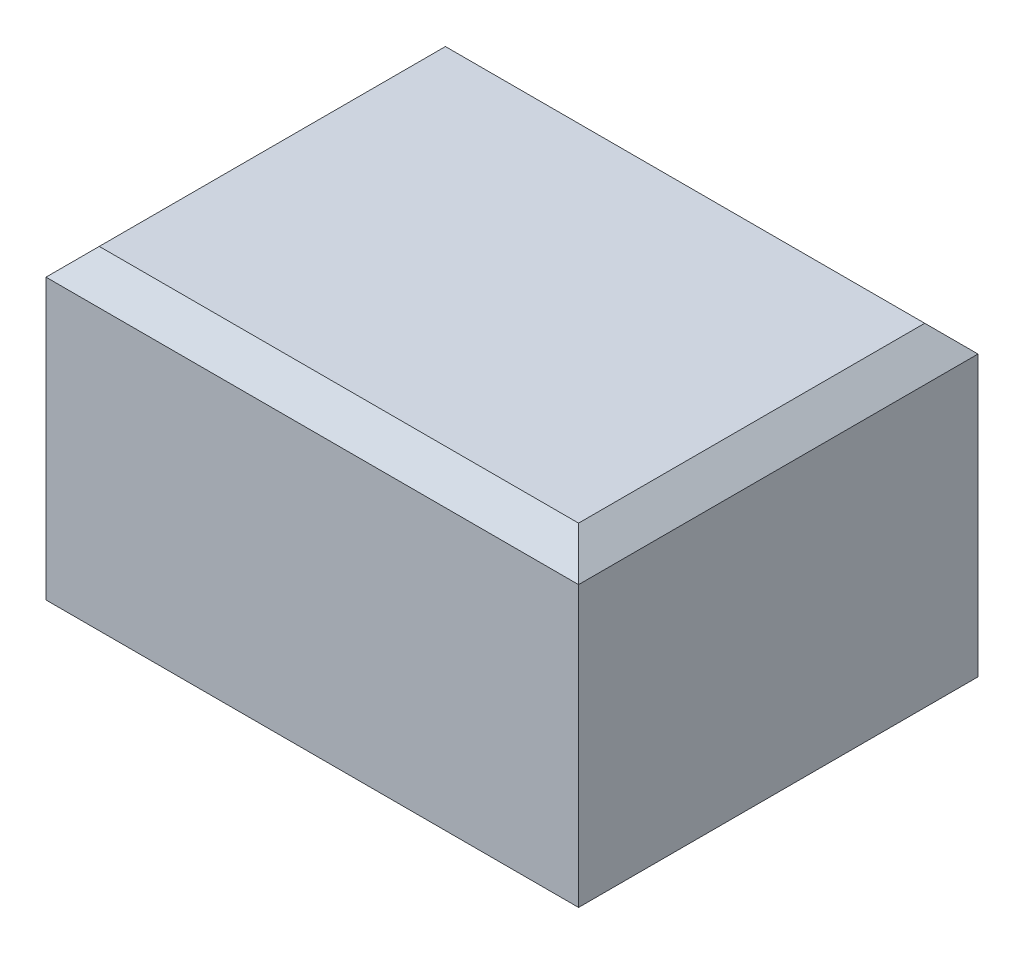
ISO-10303-21;
HEADER;
FILE_DESCRIPTION(('STEP AP214'),'2;1');
FILE_NAME('part.step','',(''),(''),'','','');
FILE_SCHEMA(('AUTOMOTIVE_DESIGN { 1 0 10303 214 1 1 1 1 }'));
ENDSEC;
DATA;
#1=APPLICATION_CONTEXT('core data for automotive mechanical design processes');
#2=APPLICATION_PROTOCOL_DEFINITION('international standard','automotive_design',2000,#1);
#3=PRODUCT_CONTEXT('',#1,'mechanical');
#4=PRODUCT('Part','Part','',(#3));
#5=PRODUCT_RELATED_PRODUCT_CATEGORY('part','',(#4));
#6=PRODUCT_DEFINITION_FORMATION('','',#4);
#7=PRODUCT_DEFINITION_CONTEXT('part definition',#1,'design');
#8=PRODUCT_DEFINITION('design','',#6,#7);
#9=PRODUCT_DEFINITION_SHAPE('','',#8);
#10=(LENGTH_UNIT() NAMED_UNIT(*) SI_UNIT(.MILLI.,.METRE.));
#11=(NAMED_UNIT(*) PLANE_ANGLE_UNIT() SI_UNIT($,.RADIAN.));
#12=(NAMED_UNIT(*) SI_UNIT($,.STERADIAN.) SOLID_ANGLE_UNIT());
#13=UNCERTAINTY_MEASURE_WITH_UNIT(LENGTH_MEASURE(1.E-05),#10,'distance_accuracy_value','');
#14=(GEOMETRIC_REPRESENTATION_CONTEXT(3) GLOBAL_UNCERTAINTY_ASSIGNED_CONTEXT((#13)) GLOBAL_UNIT_ASSIGNED_CONTEXT((#10,
#11,#12)) REPRESENTATION_CONTEXT('',''));
#15=CARTESIAN_POINT('',(0.,0.,0.));
#16=DIRECTION('',(0.,0.,1.));
#17=DIRECTION('',(1.,0.,0.));
#18=AXIS2_PLACEMENT_3D('',#15,#16,#17);
#19=CARTESIAN_POINT('',(200.,250.,-150.));
#20=DIRECTION('',(-1.,0.,0.));
#21=DIRECTION('',(0.,0.,1.));
#22=AXIS2_PLACEMENT_3D('',#19,#20,#21);
#23=PLANE('',#22);
#24=DIRECTION('',(0.,-1.,0.));
#25=VECTOR('',#24,1.);
#26=CARTESIAN_POINT('',(200.,250.,150.));
#27=LINE('',#26,#25);
#28=CARTESIAN_POINT('',(200.,230.,150.));
#29=VERTEX_POINT('',#28);
#30=CARTESIAN_POINT('',(200.,20.,150.));
#31=VERTEX_POINT('',#30);
#32=EDGE_CURVE('E167',#29,#31,#27,.T.);
#33=ORIENTED_EDGE('',*,*,#32,.T.);
#34=DIRECTION('',(0.,0.,-1.));
#35=VECTOR('',#34,1.);
#36=CARTESIAN_POINT('',(200.,20.,-150.));
#37=LINE('',#36,#35);
#38=CARTESIAN_POINT('',(200.,20.,-150.));
#39=VERTEX_POINT('',#38);
#40=EDGE_CURVE('E181',#31,#39,#37,.T.);
#41=ORIENTED_EDGE('',*,*,#40,.T.);
#42=DIRECTION('',(0.,-1.,0.));
#43=VECTOR('',#42,1.);
#44=CARTESIAN_POINT('',(200.,250.,-150.));
#45=LINE('',#44,#43);
#46=CARTESIAN_POINT('',(200.,230.,-150.));
#47=VERTEX_POINT('',#46);
#48=EDGE_CURVE('E138',#47,#39,#45,.T.);
#49=ORIENTED_EDGE('',*,*,#48,.F.);
#50=DIRECTION('',(0.,0.,1.));
#51=VECTOR('',#50,1.);
#52=CARTESIAN_POINT('',(200.,230.,150.));
#53=LINE('',#52,#51);
#54=EDGE_CURVE('E184',#47,#29,#53,.T.);
#55=ORIENTED_EDGE('',*,*,#54,.T.);
#56=EDGE_LOOP('',(#33,#41,#49,#55));
#57=FACE_BOUND('',#56,.T.);
#58=ADVANCED_FACE('F47',(#57),#23,.F.);
#59=CARTESIAN_POINT('',(-200.,250.,-150.));
#60=DIRECTION('',(0.,0.,1.));
#61=DIRECTION('',(1.,0.,0.));
#62=AXIS2_PLACEMENT_3D('',#59,#60,#61);
#63=PLANE('',#62);
#64=ORIENTED_EDGE('',*,*,#48,.T.);
#65=DIRECTION('',(-1.,0.,0.));
#66=VECTOR('',#65,1.);
#67=CARTESIAN_POINT('',(-200.,20.,-150.));
#68=LINE('',#67,#66);
#69=CARTESIAN_POINT('',(-200.,20.,-150.));
#70=VERTEX_POINT('',#69);
#71=EDGE_CURVE('E136',#39,#70,#68,.T.);
#72=ORIENTED_EDGE('',*,*,#71,.T.);
#73=DIRECTION('',(0.,-1.,0.));
#74=VECTOR('',#73,1.);
#75=CARTESIAN_POINT('',(-200.,250.,-150.));
#76=LINE('',#75,#74);
#77=CARTESIAN_POINT('',(-200.,230.,-150.));
#78=VERTEX_POINT('',#77);
#79=EDGE_CURVE('E118',#78,#70,#76,.T.);
#80=ORIENTED_EDGE('',*,*,#79,.F.);
#81=DIRECTION('',(1.,0.,0.));
#82=VECTOR('',#81,1.);
#83=CARTESIAN_POINT('',(200.,230.,-150.));
#84=LINE('',#83,#82);
#85=EDGE_CURVE('E133',#78,#47,#84,.T.);
#86=ORIENTED_EDGE('',*,*,#85,.T.);
#87=EDGE_LOOP('',(#64,#72,#80,#86));
#88=FACE_BOUND('',#87,.T.);
#89=ADVANCED_FACE('F132',(#88),#63,.F.);
#90=CARTESIAN_POINT('',(-200.,250.,-150.));
#91=DIRECTION('',(1.,0.,0.));
#92=DIRECTION('',(0.,0.,-1.));
#93=AXIS2_PLACEMENT_3D('',#90,#91,#92);
#94=PLANE('',#93);
#95=ORIENTED_EDGE('',*,*,#79,.T.);
#96=DIRECTION('',(0.,0.,1.));
#97=VECTOR('',#96,1.);
#98=CARTESIAN_POINT('',(-200.,20.,-150.));
#99=LINE('',#98,#97);
#100=CARTESIAN_POINT('',(-200.,20.,150.));
#101=VERTEX_POINT('',#100);
#102=EDGE_CURVE('E125',#70,#101,#99,.T.);
#103=ORIENTED_EDGE('',*,*,#102,.T.);
#104=DIRECTION('',(0.,-1.,0.));
#105=VECTOR('',#104,1.);
#106=CARTESIAN_POINT('',(-200.,250.,150.));
#107=LINE('',#106,#105);
#108=CARTESIAN_POINT('',(-200.,230.,150.));
#109=VERTEX_POINT('',#108);
#110=EDGE_CURVE('E120',#109,#101,#107,.T.);
#111=ORIENTED_EDGE('',*,*,#110,.F.);
#112=DIRECTION('',(0.,0.,-1.));
#113=VECTOR('',#112,1.);
#114=CARTESIAN_POINT('',(-200.,230.,-150.));
#115=LINE('',#114,#113);
#116=EDGE_CURVE('E115',#109,#78,#115,.T.);
#117=ORIENTED_EDGE('',*,*,#116,.T.);
#118=EDGE_LOOP('',(#95,#103,#111,#117));
#119=FACE_BOUND('',#118,.T.);
#120=ADVANCED_FACE('F117',(#119),#94,.F.);
#121=CARTESIAN_POINT('',(-200.,250.,150.));
#122=DIRECTION('',(0.,0.,-1.));
#123=DIRECTION('',(-1.,0.,0.));
#124=AXIS2_PLACEMENT_3D('',#121,#122,#123);
#125=PLANE('',#124);
#126=ORIENTED_EDGE('',*,*,#110,.T.);
#127=DIRECTION('',(1.,0.,0.));
#128=VECTOR('',#127,1.);
#129=CARTESIAN_POINT('',(-200.,20.,150.));
#130=LINE('',#129,#128);
#131=EDGE_CURVE('E187',#101,#31,#130,.T.);
#132=ORIENTED_EDGE('',*,*,#131,.T.);
#133=ORIENTED_EDGE('',*,*,#32,.F.);
#134=DIRECTION('',(-1.,0.,0.));
#135=VECTOR('',#134,1.);
#136=CARTESIAN_POINT('',(-200.,230.,150.));
#137=LINE('',#136,#135);
#138=EDGE_CURVE('E190',#29,#109,#137,.T.);
#139=ORIENTED_EDGE('',*,*,#138,.T.);
#140=EDGE_LOOP('',(#126,#132,#133,#139));
#141=FACE_BOUND('',#140,.T.);
#142=ADVANCED_FACE('F238',(#141),#125,.F.);
#143=CARTESIAN_POINT('',(0.,250.,0.));
#144=DIRECTION('',(0.,1.,0.));
#145=DIRECTION('',(0.,0.,1.));
#146=AXIS2_PLACEMENT_3D('',#143,#144,#145);
#147=PLANE('',#146);
#148=DIRECTION('',(0.,0.,1.));
#149=VECTOR('',#148,1.);
#150=CARTESIAN_POINT('',(-180.,250.,150.));
#151=LINE('',#150,#149);
#152=CARTESIAN_POINT('',(-180.,250.,-130.));
#153=VERTEX_POINT('',#152);
#154=CARTESIAN_POINT('',(-180.,250.,130.));
#155=VERTEX_POINT('',#154);
#156=EDGE_CURVE('E58',#153,#155,#151,.T.);
#157=ORIENTED_EDGE('',*,*,#156,.T.);
#158=DIRECTION('',(1.,0.,0.));
#159=VECTOR('',#158,1.);
#160=CARTESIAN_POINT('',(200.,250.,130.));
#161=LINE('',#160,#159);
#162=CARTESIAN_POINT('',(180.,250.,130.));
#163=VERTEX_POINT('',#162);
#164=EDGE_CURVE('E11',#155,#163,#161,.T.);
#165=ORIENTED_EDGE('',*,*,#164,.T.);
#166=DIRECTION('',(0.,0.,-1.));
#167=VECTOR('',#166,1.);
#168=CARTESIAN_POINT('',(180.,250.,-150.));
#169=LINE('',#168,#167);
#170=CARTESIAN_POINT('',(180.,250.,-130.));
#171=VERTEX_POINT('',#170);
#172=EDGE_CURVE('E178',#163,#171,#169,.T.);
#173=ORIENTED_EDGE('',*,*,#172,.T.);
#174=DIRECTION('',(-1.,0.,0.));
#175=VECTOR('',#174,1.);
#176=CARTESIAN_POINT('',(-200.,250.,-130.));
#177=LINE('',#176,#175);
#178=EDGE_CURVE('E69',#171,#153,#177,.T.);
#179=ORIENTED_EDGE('',*,*,#178,.T.);
#180=EDGE_LOOP('',(#157,#165,#173,#179));
#181=FACE_BOUND('',#180,.T.);
#182=ADVANCED_FACE('F244',(#181),#147,.T.);
#183=CARTESIAN_POINT('',(0.,0.,0.));
#184=DIRECTION('',(0.,1.,0.));
#185=DIRECTION('',(0.,0.,1.));
#186=AXIS2_PLACEMENT_3D('',#183,#184,#185);
#187=PLANE('',#186);
#188=DIRECTION('',(0.,0.,-1.));
#189=VECTOR('',#188,1.);
#190=CARTESIAN_POINT('',(-180.,0.,0.));
#191=LINE('',#190,#189);
#192=CARTESIAN_POINT('',(-180.,0.,130.));
#193=VERTEX_POINT('',#192);
#194=CARTESIAN_POINT('',(-180.,0.,-130.));
#195=VERTEX_POINT('',#194);
#196=EDGE_CURVE('E198',#193,#195,#191,.T.);
#197=ORIENTED_EDGE('',*,*,#196,.T.);
#198=DIRECTION('',(1.,0.,0.));
#199=VECTOR('',#198,1.);
#200=CARTESIAN_POINT('',(0.,0.,-130.));
#201=LINE('',#200,#199);
#202=CARTESIAN_POINT('',(180.,0.,-130.));
#203=VERTEX_POINT('',#202);
#204=EDGE_CURVE('E126',#195,#203,#201,.T.);
#205=ORIENTED_EDGE('',*,*,#204,.T.);
#206=DIRECTION('',(0.,0.,1.));
#207=VECTOR('',#206,1.);
#208=CARTESIAN_POINT('',(180.,0.,0.));
#209=LINE('',#208,#207);
#210=CARTESIAN_POINT('',(180.,0.,130.));
#211=VERTEX_POINT('',#210);
#212=EDGE_CURVE('E204',#203,#211,#209,.T.);
#213=ORIENTED_EDGE('',*,*,#212,.T.);
#214=DIRECTION('',(-1.,0.,0.));
#215=VECTOR('',#214,1.);
#216=CARTESIAN_POINT('',(0.,0.,130.));
#217=LINE('',#216,#215);
#218=EDGE_CURVE('E201',#211,#193,#217,.T.);
#219=ORIENTED_EDGE('',*,*,#218,.T.);
#220=EDGE_LOOP('',(#197,#205,#213,#219));
#221=FACE_BOUND('',#220,.T.);
#222=ADVANCED_FACE('F246',(#221),#187,.F.);
#223=CARTESIAN_POINT('',(-200.,20.,150.));
#224=DIRECTION('',(0.,0.707106781186549,-0.707106781186545));
#225=DIRECTION('',(1.,0.,0.));
#226=AXIS2_PLACEMENT_3D('',#223,#224,#225);
#227=PLANE('',#226);
#228=DIRECTION('',(0.577350269189628,-0.577350269189623,-0.577350269189626));
#229=VECTOR('',#228,1.);
#230=CARTESIAN_POINT('',(-200.,20.,150.));
#231=LINE('',#230,#229);
#232=EDGE_CURVE('E168',#193,#101,#231,.F.);
#233=ORIENTED_EDGE('',*,*,#232,.F.);
#234=ORIENTED_EDGE('',*,*,#218,.F.);
#235=DIRECTION('',(-0.577350269189627,-0.577350269189624,-0.577350269189627));
#236=VECTOR('',#235,1.);
#237=CARTESIAN_POINT('',(99.9999999999996,-79.9999999999998,49.9999999999996));
#238=LINE('',#237,#236);
#239=EDGE_CURVE('E163',#31,#211,#238,.T.);
#240=ORIENTED_EDGE('',*,*,#239,.F.);
#241=ORIENTED_EDGE('',*,*,#131,.F.);
#242=EDGE_LOOP('',(#233,#234,#240,#241));
#243=FACE_BOUND('',#242,.T.);
#244=ADVANCED_FACE('F225',(#243),#227,.F.);
#245=CARTESIAN_POINT('',(200.,20.,-150.));
#246=DIRECTION('',(-0.707106781186545,0.707106781186549,0.));
#247=DIRECTION('',(0.,0.,-1.));
#248=AXIS2_PLACEMENT_3D('',#245,#246,#247);
#249=PLANE('',#248);
#250=ORIENTED_EDGE('',*,*,#239,.T.);
#251=ORIENTED_EDGE('',*,*,#212,.F.);
#252=DIRECTION('',(0.577350269189627,0.577350269189624,-0.577350269189627));
#253=VECTOR('',#252,1.);
#254=CARTESIAN_POINT('',(200.,20.,-150.));
#255=LINE('',#254,#253);
#256=EDGE_CURVE('E152',#39,#203,#255,.F.);
#257=ORIENTED_EDGE('',*,*,#256,.F.);
#258=ORIENTED_EDGE('',*,*,#40,.F.);
#259=EDGE_LOOP('',(#250,#251,#257,#258));
#260=FACE_BOUND('',#259,.T.);
#261=ADVANCED_FACE('F229',(#260),#249,.F.);
#262=CARTESIAN_POINT('',(-200.,20.,-150.));
#263=DIRECTION('',(0.707106781186545,0.70710678118655,0.));
#264=DIRECTION('',(0.,0.,1.));
#265=AXIS2_PLACEMENT_3D('',#262,#263,#264);
#266=PLANE('',#265);
#267=ORIENTED_EDGE('',*,*,#232,.T.);
#268=ORIENTED_EDGE('',*,*,#102,.F.);
#269=DIRECTION('',(0.577350269189628,-0.577350269189623,0.577350269189626));
#270=VECTOR('',#269,1.);
#271=CARTESIAN_POINT('',(-200.,20.,-150.));
#272=LINE('',#271,#270);
#273=EDGE_CURVE('E149',#195,#70,#272,.F.);
#274=ORIENTED_EDGE('',*,*,#273,.F.);
#275=ORIENTED_EDGE('',*,*,#196,.F.);
#276=EDGE_LOOP('',(#267,#268,#274,#275));
#277=FACE_BOUND('',#276,.T.);
#278=ADVANCED_FACE('F237',(#277),#266,.F.);
#279=CARTESIAN_POINT('',(-200.,20.,-150.));
#280=DIRECTION('',(0.,0.707106781186549,0.707106781186545));
#281=DIRECTION('',(-1.,0.,0.));
#282=AXIS2_PLACEMENT_3D('',#279,#280,#281);
#283=PLANE('',#282);
#284=ORIENTED_EDGE('',*,*,#256,.T.);
#285=ORIENTED_EDGE('',*,*,#204,.F.);
#286=ORIENTED_EDGE('',*,*,#273,.T.);
#287=ORIENTED_EDGE('',*,*,#71,.F.);
#288=EDGE_LOOP('',(#284,#285,#286,#287));
#289=FACE_BOUND('',#288,.T.);
#290=ADVANCED_FACE('F232',(#289),#283,.F.);
#291=CARTESIAN_POINT('',(0.,250.,-130.));
#292=DIRECTION('',(0.,0.707106781186545,-0.70710678118655));
#293=DIRECTION('',(1.,0.,0.));
#294=AXIS2_PLACEMENT_3D('',#291,#292,#293);
#295=PLANE('',#294);
#296=DIRECTION('',(-0.577350269189624,0.577350269189628,0.577350269189624));
#297=VECTOR('',#296,1.);
#298=CARTESIAN_POINT('',(136.666666666667,293.333333333333,-86.666666666667));
#299=LINE('',#298,#297);
#300=EDGE_CURVE('E143',#47,#171,#299,.T.);
#301=ORIENTED_EDGE('',*,*,#300,.F.);
#302=ORIENTED_EDGE('',*,*,#85,.F.);
#303=DIRECTION('',(0.577350269189625,0.577350269189628,0.577350269189624));
#304=VECTOR('',#303,1.);
#305=CARTESIAN_POINT('',(-120.,310.,-70.0000000000004));
#306=LINE('',#305,#304);
#307=EDGE_CURVE('E52',#153,#78,#306,.F.);
#308=ORIENTED_EDGE('',*,*,#307,.F.);
#309=ORIENTED_EDGE('',*,*,#178,.F.);
#310=EDGE_LOOP('',(#301,#302,#308,#309));
#311=FACE_BOUND('',#310,.T.);
#312=ADVANCED_FACE('F50',(#311),#295,.T.);
#313=CARTESIAN_POINT('',(-180.,250.,0.));
#314=DIRECTION('',(-0.707106781186549,0.707106781186546,0.));
#315=DIRECTION('',(0.,0.,-1.));
#316=AXIS2_PLACEMENT_3D('',#313,#314,#315);
#317=PLANE('',#316);
#318=ORIENTED_EDGE('',*,*,#307,.T.);
#319=ORIENTED_EDGE('',*,*,#116,.F.);
#320=DIRECTION('',(0.577350269189625,0.577350269189628,-0.577350269189624));
#321=VECTOR('',#320,1.);
#322=CARTESIAN_POINT('',(-136.666666666667,293.333333333333,86.666666666667));
#323=LINE('',#322,#321);
#324=EDGE_CURVE('E154',#155,#109,#323,.F.);
#325=ORIENTED_EDGE('',*,*,#324,.F.);
#326=ORIENTED_EDGE('',*,*,#156,.F.);
#327=EDGE_LOOP('',(#318,#319,#325,#326));
#328=FACE_BOUND('',#327,.T.);
#329=ADVANCED_FACE('F147',(#328),#317,.T.);
#330=CARTESIAN_POINT('',(180.,250.,0.));
#331=DIRECTION('',(0.70710678118655,0.707106781186545,0.));
#332=DIRECTION('',(0.,0.,1.));
#333=AXIS2_PLACEMENT_3D('',#330,#331,#332);
#334=PLANE('',#333);
#335=ORIENTED_EDGE('',*,*,#300,.T.);
#336=ORIENTED_EDGE('',*,*,#172,.F.);
#337=DIRECTION('',(0.577350269189625,-0.577350269189628,0.577350269189624));
#338=VECTOR('',#337,1.);
#339=CARTESIAN_POINT('',(136.666666666667,293.333333333333,86.6666666666669));
#340=LINE('',#339,#338);
#341=EDGE_CURVE('E158',#29,#163,#340,.F.);
#342=ORIENTED_EDGE('',*,*,#341,.F.);
#343=ORIENTED_EDGE('',*,*,#54,.F.);
#344=EDGE_LOOP('',(#335,#336,#342,#343));
#345=FACE_BOUND('',#344,.T.);
#346=ADVANCED_FACE('F243',(#345),#334,.T.);
#347=CARTESIAN_POINT('',(0.,250.,130.));
#348=DIRECTION('',(0.,0.707106781186545,0.70710678118655));
#349=DIRECTION('',(-1.,0.,0.));
#350=AXIS2_PLACEMENT_3D('',#347,#348,#349);
#351=PLANE('',#350);
#352=ORIENTED_EDGE('',*,*,#324,.T.);
#353=ORIENTED_EDGE('',*,*,#138,.F.);
#354=ORIENTED_EDGE('',*,*,#341,.T.);
#355=ORIENTED_EDGE('',*,*,#164,.F.);
#356=EDGE_LOOP('',(#352,#353,#354,#355));
#357=FACE_BOUND('',#356,.T.);
#358=ADVANCED_FACE('F241',(#357),#351,.T.);
#359=CLOSED_SHELL('',(#58,#89,#120,#142,#182,#222,#244,#261,#278,#290,#312,#329,#346,#358));
#360=MANIFOLD_SOLID_BREP('B2',#359);
#361=ADVANCED_BREP_SHAPE_REPRESENTATION('',(#18,#360),#14);
#362=SHAPE_DEFINITION_REPRESENTATION(#9,#361);
ENDSEC;
END-ISO-10303-21;
